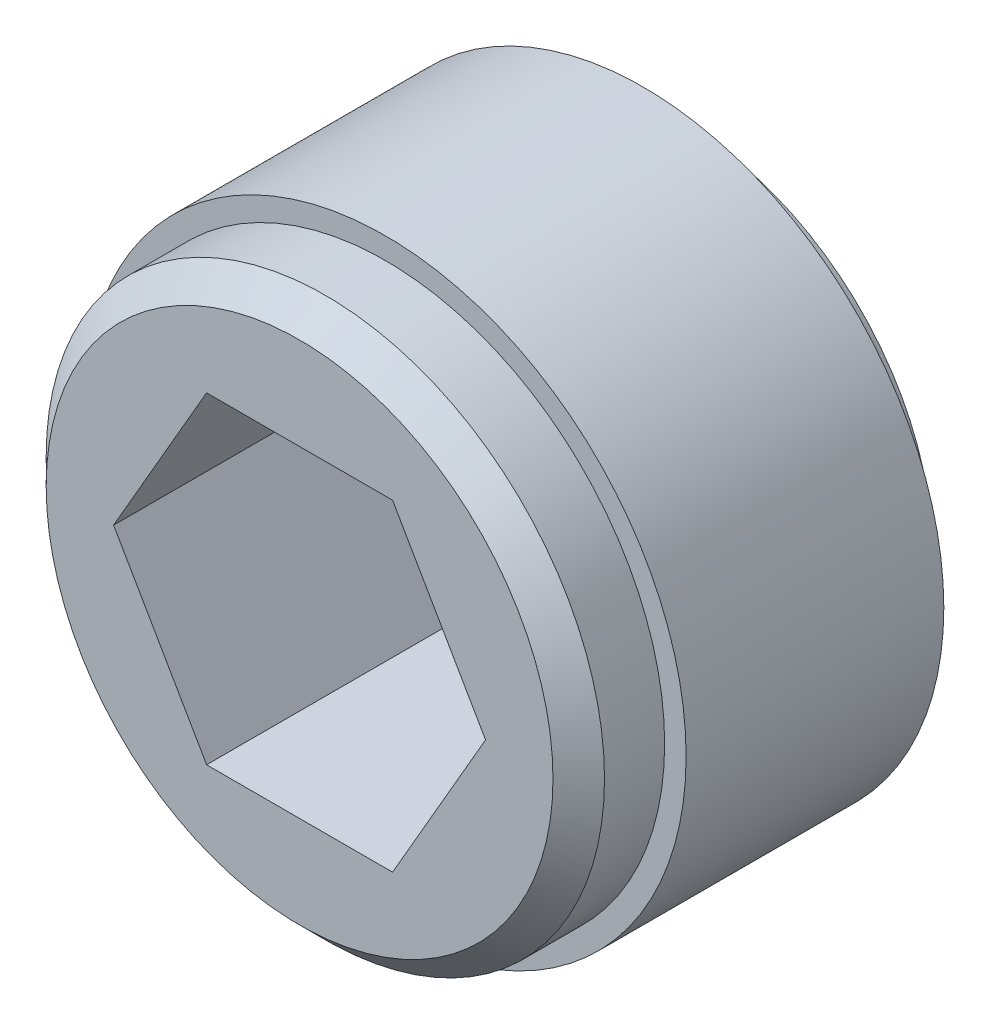
ISO-10303-21;
HEADER;
FILE_DESCRIPTION(('STEP AP214'),'2;1');
FILE_NAME('part.step','',(''),(''),'','','');
FILE_SCHEMA(('AUTOMOTIVE_DESIGN { 1 0 10303 214 1 1 1 1 }'));
ENDSEC;
DATA;
#1=APPLICATION_CONTEXT('core data for automotive mechanical design processes');
#2=APPLICATION_PROTOCOL_DEFINITION('international standard','automotive_design',2000,#1);
#3=PRODUCT_CONTEXT('',#1,'mechanical');
#4=PRODUCT('Part','Part','',(#3));
#5=PRODUCT_RELATED_PRODUCT_CATEGORY('part','',(#4));
#6=PRODUCT_DEFINITION_FORMATION('','',#4);
#7=PRODUCT_DEFINITION_CONTEXT('part definition',#1,'design');
#8=PRODUCT_DEFINITION('design','',#6,#7);
#9=PRODUCT_DEFINITION_SHAPE('','',#8);
#10=(LENGTH_UNIT() NAMED_UNIT(*) SI_UNIT(.MILLI.,.METRE.));
#11=(NAMED_UNIT(*) PLANE_ANGLE_UNIT() SI_UNIT($,.RADIAN.));
#12=(NAMED_UNIT(*) SI_UNIT($,.STERADIAN.) SOLID_ANGLE_UNIT());
#13=UNCERTAINTY_MEASURE_WITH_UNIT(LENGTH_MEASURE(1.E-05),#10,'distance_accuracy_value','');
#14=(GEOMETRIC_REPRESENTATION_CONTEXT(3) GLOBAL_UNCERTAINTY_ASSIGNED_CONTEXT((#13)) GLOBAL_UNIT_ASSIGNED_CONTEXT((#10,
#11,#12)) REPRESENTATION_CONTEXT('',''));
#15=CARTESIAN_POINT('',(0.,0.,0.));
#16=DIRECTION('',(0.,0.,1.));
#17=DIRECTION('',(1.,0.,0.));
#18=AXIS2_PLACEMENT_3D('',#15,#16,#17);
#19=CARTESIAN_POINT('',(0.,0.,5.08));
#20=DIRECTION('',(0.,0.,-1.));
#21=DIRECTION('',(-1.,0.,0.));
#22=AXIS2_PLACEMENT_3D('',#19,#20,#21);
#23=CYLINDRICAL_SURFACE('',#22,4.445);
#24=CARTESIAN_POINT('',(0.,0.,0.));
#25=DIRECTION('',(0.,0.,1.));
#26=DIRECTION('',(1.,0.,0.));
#27=AXIS2_PLACEMENT_3D('',#24,#25,#26);
#28=CIRCLE('',#27,4.445);
#29=CARTESIAN_POINT('',(4.445,0.,0.));
#30=VERTEX_POINT('',#29);
#31=EDGE_CURVE('E158',#30,#30,#28,.T.);
#32=ORIENTED_EDGE('',*,*,#31,.T.);
#33=EDGE_LOOP('',(#32));
#34=FACE_BOUND('',#33,.T.);
#35=CARTESIAN_POINT('',(0.,0.,3.81));
#36=DIRECTION('',(0.,0.,1.));
#37=DIRECTION('',(1.,0.,0.));
#38=AXIS2_PLACEMENT_3D('',#35,#36,#37);
#39=CIRCLE('',#38,4.445);
#40=CARTESIAN_POINT('',(4.445,0.,3.81));
#41=VERTEX_POINT('',#40);
#42=EDGE_CURVE('E151',#41,#41,#39,.T.);
#43=ORIENTED_EDGE('',*,*,#42,.F.);
#44=EDGE_LOOP('',(#43));
#45=FACE_BOUND('',#44,.T.);
#46=ADVANCED_FACE('F42',(#34,#45),#23,.T.);
#47=CARTESIAN_POINT('',(0.,0.,0.));
#48=DIRECTION('',(0.,0.,1.));
#49=DIRECTION('',(1.,0.,0.));
#50=AXIS2_PLACEMENT_3D('',#47,#48,#49);
#51=PLANE('',#50);
#52=CARTESIAN_POINT('',(0.,0.,0.));
#53=DIRECTION('',(0.,0.,-1.));
#54=DIRECTION('',(-1.,0.,0.));
#55=AXIS2_PLACEMENT_3D('',#52,#53,#54);
#56=CIRCLE('',#55,3.81);
#57=CARTESIAN_POINT('',(-3.81,0.,0.));
#58=VERTEX_POINT('',#57);
#59=EDGE_CURVE('E155',#58,#58,#56,.T.);
#60=ORIENTED_EDGE('',*,*,#59,.F.);
#61=EDGE_LOOP('',(#60));
#62=FACE_BOUND('',#61,.T.);
#63=ORIENTED_EDGE('',*,*,#31,.F.);
#64=EDGE_LOOP('',(#63));
#65=FACE_BOUND('',#64,.T.);
#66=ADVANCED_FACE('F180',(#62,#65),#51,.F.);
#67=CARTESIAN_POINT('',(0.,0.,0.));
#68=DIRECTION('',(0.,0.,1.));
#69=DIRECTION('',(-1.,0.,0.));
#70=AXIS2_PLACEMENT_3D('',#67,#68,#69);
#71=CONICAL_SURFACE('',#70,3.81,0.26179938779915);
#72=CARTESIAN_POINT('',(0.,0.,-0.635));
#73=DIRECTION('',(0.,0.,-1.));
#74=DIRECTION('',(-1.,0.,0.));
#75=AXIS2_PLACEMENT_3D('',#72,#73,#74);
#76=CIRCLE('',#75,3.63985226280624);
#77=CARTESIAN_POINT('',(-3.63985226280624,0.,-0.635));
#78=VERTEX_POINT('',#77);
#79=EDGE_CURVE('E154',#78,#78,#76,.T.);
#80=ORIENTED_EDGE('',*,*,#79,.F.);
#81=EDGE_LOOP('',(#80));
#82=FACE_BOUND('',#81,.T.);
#83=ORIENTED_EDGE('',*,*,#59,.T.);
#84=EDGE_LOOP('',(#83));
#85=FACE_BOUND('',#84,.T.);
#86=ADVANCED_FACE('F185',(#82,#85),#71,.T.);
#87=CARTESIAN_POINT('',(0.,0.,-0.635));
#88=DIRECTION('',(0.,0.,-1.));
#89=DIRECTION('',(-1.,0.,0.));
#90=AXIS2_PLACEMENT_3D('',#87,#88,#89);
#91=PLANE('',#90);
#92=DIRECTION('',(-1.,0.,0.));
#93=VECTOR('',#92,1.);
#94=CARTESIAN_POINT('',(1.3748153285078,2.38125,-0.635));
#95=LINE('',#94,#93);
#96=CARTESIAN_POINT('',(1.3748153285078,2.38125,-0.635));
#97=VERTEX_POINT('',#96);
#98=CARTESIAN_POINT('',(-1.3748153285078,2.38125,-0.635));
#99=VERTEX_POINT('',#98);
#100=EDGE_CURVE('E98',#97,#99,#95,.T.);
#101=ORIENTED_EDGE('',*,*,#100,.T.);
#102=DIRECTION('',(-0.5,-0.866025403784439,0.));
#103=VECTOR('',#102,1.);
#104=CARTESIAN_POINT('',(-1.3748153285078,2.38125,-0.635));
#105=LINE('',#104,#103);
#106=CARTESIAN_POINT('',(-2.74963065701559,0.,-0.635));
#107=VERTEX_POINT('',#106);
#108=EDGE_CURVE('E107',#99,#107,#105,.T.);
#109=ORIENTED_EDGE('',*,*,#108,.T.);
#110=DIRECTION('',(0.5,-0.866025403784439,0.));
#111=VECTOR('',#110,1.);
#112=CARTESIAN_POINT('',(-2.74963065701559,0.,-0.635));
#113=LINE('',#112,#111);
#114=CARTESIAN_POINT('',(-1.3748153285078,-2.38125,-0.635));
#115=VERTEX_POINT('',#114);
#116=EDGE_CURVE('E58',#107,#115,#113,.T.);
#117=ORIENTED_EDGE('',*,*,#116,.T.);
#118=DIRECTION('',(1.,0.,0.));
#119=VECTOR('',#118,1.);
#120=CARTESIAN_POINT('',(-1.3748153285078,-2.38125,-0.635));
#121=LINE('',#120,#119);
#122=CARTESIAN_POINT('',(1.3748153285078,-2.38125,-0.635));
#123=VERTEX_POINT('',#122);
#124=EDGE_CURVE('E122',#115,#123,#121,.T.);
#125=ORIENTED_EDGE('',*,*,#124,.T.);
#126=DIRECTION('',(0.5,0.866025403784439,0.));
#127=VECTOR('',#126,1.);
#128=CARTESIAN_POINT('',(1.3748153285078,-2.38125,-0.635));
#129=LINE('',#128,#127);
#130=CARTESIAN_POINT('',(2.74963065701559,0.,-0.635));
#131=VERTEX_POINT('',#130);
#132=EDGE_CURVE('E125',#123,#131,#129,.T.);
#133=ORIENTED_EDGE('',*,*,#132,.T.);
#134=DIRECTION('',(-0.5,0.866025403784439,0.));
#135=VECTOR('',#134,1.);
#136=CARTESIAN_POINT('',(2.74963065701559,0.,-0.635));
#137=LINE('',#136,#135);
#138=EDGE_CURVE('E104',#131,#97,#137,.T.);
#139=ORIENTED_EDGE('',*,*,#138,.T.);
#140=EDGE_LOOP('',(#101,#109,#117,#125,#133,#139));
#141=FACE_BOUND('',#140,.T.);
#142=ORIENTED_EDGE('',*,*,#79,.T.);
#143=EDGE_LOOP('',(#142));
#144=FACE_BOUND('',#143,.T.);
#145=ADVANCED_FACE('F111',(#141,#144),#91,.T.);
#146=CARTESIAN_POINT('',(0.,0.,3.81));
#147=DIRECTION('',(0.,0.,1.));
#148=DIRECTION('',(1.,0.,0.));
#149=AXIS2_PLACEMENT_3D('',#146,#147,#148);
#150=CYLINDRICAL_SURFACE('',#149,4.1275);
#151=CARTESIAN_POINT('',(0.,0.,4.699));
#152=DIRECTION('',(0.,0.,1.));
#153=DIRECTION('',(1.,0.,0.));
#154=AXIS2_PLACEMENT_3D('',#151,#152,#153);
#155=CIRCLE('',#154,4.1275);
#156=CARTESIAN_POINT('',(4.1275,0.,4.699));
#157=VERTEX_POINT('',#156);
#158=EDGE_CURVE('E11',#157,#157,#155,.F.);
#159=ORIENTED_EDGE('',*,*,#158,.T.);
#160=EDGE_LOOP('',(#159));
#161=FACE_BOUND('',#160,.T.);
#162=CARTESIAN_POINT('',(0.,0.,3.81));
#163=DIRECTION('',(0.,0.,1.));
#164=DIRECTION('',(1.,0.,0.));
#165=AXIS2_PLACEMENT_3D('',#162,#163,#164);
#166=CIRCLE('',#165,4.1275);
#167=CARTESIAN_POINT('',(4.1275,0.,3.81));
#168=VERTEX_POINT('',#167);
#169=EDGE_CURVE('E141',#168,#168,#166,.T.);
#170=ORIENTED_EDGE('',*,*,#169,.T.);
#171=EDGE_LOOP('',(#170));
#172=FACE_BOUND('',#171,.T.);
#173=ADVANCED_FACE('F195',(#161,#172),#150,.T.);
#174=CARTESIAN_POINT('',(0.,0.,3.81));
#175=DIRECTION('',(0.,0.,1.));
#176=DIRECTION('',(1.,0.,0.));
#177=AXIS2_PLACEMENT_3D('',#174,#175,#176);
#178=PLANE('',#177);
#179=ORIENTED_EDGE('',*,*,#169,.F.);
#180=EDGE_LOOP('',(#179));
#181=FACE_BOUND('',#180,.T.);
#182=ORIENTED_EDGE('',*,*,#42,.T.);
#183=EDGE_LOOP('',(#182));
#184=FACE_BOUND('',#183,.T.);
#185=ADVANCED_FACE('F175',(#181,#184),#178,.T.);
#186=CARTESIAN_POINT('',(0.,0.,5.08));
#187=DIRECTION('',(0.,0.,1.));
#188=DIRECTION('',(1.,0.,0.));
#189=AXIS2_PLACEMENT_3D('',#186,#187,#188);
#190=PLANE('',#189);
#191=DIRECTION('',(-1.,0.,0.));
#192=VECTOR('',#191,1.);
#193=CARTESIAN_POINT('',(1.3748153285078,2.38125,5.08));
#194=LINE('',#193,#192);
#195=CARTESIAN_POINT('',(1.3748153285078,2.38125,5.08));
#196=VERTEX_POINT('',#195);
#197=CARTESIAN_POINT('',(-1.3748153285078,2.38125,5.08));
#198=VERTEX_POINT('',#197);
#199=EDGE_CURVE('E66',#196,#198,#194,.T.);
#200=ORIENTED_EDGE('',*,*,#199,.F.);
#201=DIRECTION('',(-0.5,0.866025403784439,0.));
#202=VECTOR('',#201,1.);
#203=CARTESIAN_POINT('',(2.74963065701559,0.,5.08));
#204=LINE('',#203,#202);
#205=CARTESIAN_POINT('',(2.74963065701559,0.,5.08));
#206=VERTEX_POINT('',#205);
#207=EDGE_CURVE('E115',#206,#196,#204,.T.);
#208=ORIENTED_EDGE('',*,*,#207,.F.);
#209=DIRECTION('',(0.5,0.866025403784439,0.));
#210=VECTOR('',#209,1.);
#211=CARTESIAN_POINT('',(1.3748153285078,-2.38125,5.08));
#212=LINE('',#211,#210);
#213=CARTESIAN_POINT('',(1.3748153285078,-2.38125,5.08));
#214=VERTEX_POINT('',#213);
#215=EDGE_CURVE('E118',#214,#206,#212,.T.);
#216=ORIENTED_EDGE('',*,*,#215,.F.);
#217=DIRECTION('',(1.,0.,0.));
#218=VECTOR('',#217,1.);
#219=CARTESIAN_POINT('',(-1.3748153285078,-2.38125,5.08));
#220=LINE('',#219,#218);
#221=CARTESIAN_POINT('',(-1.3748153285078,-2.38125,5.08));
#222=VERTEX_POINT('',#221);
#223=EDGE_CURVE('E134',#222,#214,#220,.T.);
#224=ORIENTED_EDGE('',*,*,#223,.F.);
#225=DIRECTION('',(0.5,-0.866025403784439,0.));
#226=VECTOR('',#225,1.);
#227=CARTESIAN_POINT('',(-2.74963065701559,0.,5.08));
#228=LINE('',#227,#226);
#229=CARTESIAN_POINT('',(-2.74963065701559,0.,5.08));
#230=VERTEX_POINT('',#229);
#231=EDGE_CURVE('E131',#230,#222,#228,.T.);
#232=ORIENTED_EDGE('',*,*,#231,.F.);
#233=DIRECTION('',(-0.5,-0.866025403784439,0.));
#234=VECTOR('',#233,1.);
#235=CARTESIAN_POINT('',(-1.3748153285078,2.38125,5.08));
#236=LINE('',#235,#234);
#237=EDGE_CURVE('E129',#198,#230,#236,.T.);
#238=ORIENTED_EDGE('',*,*,#237,.F.);
#239=EDGE_LOOP('',(#200,#208,#216,#224,#232,#238));
#240=FACE_BOUND('',#239,.T.);
#241=CARTESIAN_POINT('',(0.,0.,5.08));
#242=DIRECTION('',(0.,0.,1.));
#243=DIRECTION('',(1.,0.,0.));
#244=AXIS2_PLACEMENT_3D('',#241,#242,#243);
#245=CIRCLE('',#244,3.7465);
#246=CARTESIAN_POINT('',(3.7465,0.,5.08));
#247=VERTEX_POINT('',#246);
#248=EDGE_CURVE('E51',#247,#247,#245,.T.);
#249=ORIENTED_EDGE('',*,*,#248,.T.);
#250=EDGE_LOOP('',(#249));
#251=FACE_BOUND('',#250,.T.);
#252=ADVANCED_FACE('F165',(#240,#251),#190,.T.);
#253=CARTESIAN_POINT('',(0.,0.,5.08));
#254=DIRECTION('',(0.,0.,-1.));
#255=DIRECTION('',(-1.,0.,0.));
#256=AXIS2_PLACEMENT_3D('',#253,#254,#255);
#257=CONICAL_SURFACE('',#256,3.7465,0.785398163397448);
#258=ORIENTED_EDGE('',*,*,#158,.F.);
#259=EDGE_LOOP('',(#258));
#260=FACE_BOUND('',#259,.T.);
#261=ORIENTED_EDGE('',*,*,#248,.F.);
#262=EDGE_LOOP('',(#261));
#263=FACE_BOUND('',#262,.T.);
#264=ADVANCED_FACE('F45',(#260,#263),#257,.T.);
#265=CARTESIAN_POINT('',(1.3748153285078,2.38125,-0.635));
#266=DIRECTION('',(0.,1.,0.));
#267=DIRECTION('',(0.,0.,1.));
#268=AXIS2_PLACEMENT_3D('',#265,#266,#267);
#269=PLANE('',#268);
#270=ORIENTED_EDGE('',*,*,#199,.T.);
#271=DIRECTION('',(0.,0.,1.));
#272=VECTOR('',#271,1.);
#273=CARTESIAN_POINT('',(-1.3748153285078,2.38125,-0.635));
#274=LINE('',#273,#272);
#275=EDGE_CURVE('E94',#99,#198,#274,.T.);
#276=ORIENTED_EDGE('',*,*,#275,.F.);
#277=ORIENTED_EDGE('',*,*,#100,.F.);
#278=DIRECTION('',(0.,0.,1.));
#279=VECTOR('',#278,1.);
#280=CARTESIAN_POINT('',(1.3748153285078,2.38125,-0.635));
#281=LINE('',#280,#279);
#282=EDGE_CURVE('E139',#97,#196,#281,.T.);
#283=ORIENTED_EDGE('',*,*,#282,.T.);
#284=EDGE_LOOP('',(#270,#276,#277,#283));
#285=FACE_BOUND('',#284,.T.);
#286=ADVANCED_FACE('F96',(#285),#269,.F.);
#287=CARTESIAN_POINT('',(2.74963065701559,0.,-0.635));
#288=DIRECTION('',(0.866025403784438,0.5,0.));
#289=DIRECTION('',(-0.5,0.866025403784439,0.));
#290=AXIS2_PLACEMENT_3D('',#287,#288,#289);
#291=PLANE('',#290);
#292=ORIENTED_EDGE('',*,*,#207,.T.);
#293=ORIENTED_EDGE('',*,*,#282,.F.);
#294=ORIENTED_EDGE('',*,*,#138,.F.);
#295=DIRECTION('',(0.,0.,1.));
#296=VECTOR('',#295,1.);
#297=CARTESIAN_POINT('',(2.74963065701559,0.,-0.635));
#298=LINE('',#297,#296);
#299=EDGE_CURVE('E142',#131,#206,#298,.T.);
#300=ORIENTED_EDGE('',*,*,#299,.T.);
#301=EDGE_LOOP('',(#292,#293,#294,#300));
#302=FACE_BOUND('',#301,.T.);
#303=ADVANCED_FACE('F173',(#302),#291,.F.);
#304=CARTESIAN_POINT('',(1.3748153285078,-2.38125,-0.635));
#305=DIRECTION('',(0.866025403784439,-0.5,0.));
#306=DIRECTION('',(0.5,0.866025403784439,0.));
#307=AXIS2_PLACEMENT_3D('',#304,#305,#306);
#308=PLANE('',#307);
#309=ORIENTED_EDGE('',*,*,#215,.T.);
#310=ORIENTED_EDGE('',*,*,#299,.F.);
#311=ORIENTED_EDGE('',*,*,#132,.F.);
#312=DIRECTION('',(0.,0.,1.));
#313=VECTOR('',#312,1.);
#314=CARTESIAN_POINT('',(1.3748153285078,-2.38125,-0.635));
#315=LINE('',#314,#313);
#316=EDGE_CURVE('E144',#123,#214,#315,.T.);
#317=ORIENTED_EDGE('',*,*,#316,.T.);
#318=EDGE_LOOP('',(#309,#310,#311,#317));
#319=FACE_BOUND('',#318,.T.);
#320=ADVANCED_FACE('F210',(#319),#308,.F.);
#321=CARTESIAN_POINT('',(-1.3748153285078,-2.38125,-0.635));
#322=DIRECTION('',(0.,-1.,0.));
#323=DIRECTION('',(1.,0.,0.));
#324=AXIS2_PLACEMENT_3D('',#321,#322,#323);
#325=PLANE('',#324);
#326=ORIENTED_EDGE('',*,*,#223,.T.);
#327=ORIENTED_EDGE('',*,*,#316,.F.);
#328=ORIENTED_EDGE('',*,*,#124,.F.);
#329=DIRECTION('',(0.,0.,1.));
#330=VECTOR('',#329,1.);
#331=CARTESIAN_POINT('',(-1.3748153285078,-2.38125,-0.635));
#332=LINE('',#331,#330);
#333=EDGE_CURVE('E146',#115,#222,#332,.T.);
#334=ORIENTED_EDGE('',*,*,#333,.T.);
#335=EDGE_LOOP('',(#326,#327,#328,#334));
#336=FACE_BOUND('',#335,.T.);
#337=ADVANCED_FACE('F207',(#336),#325,.F.);
#338=CARTESIAN_POINT('',(-2.74963065701559,0.,-0.635));
#339=DIRECTION('',(-0.866025403784438,-0.5,0.));
#340=DIRECTION('',(0.5,-0.866025403784439,0.));
#341=AXIS2_PLACEMENT_3D('',#338,#339,#340);
#342=PLANE('',#341);
#343=ORIENTED_EDGE('',*,*,#231,.T.);
#344=ORIENTED_EDGE('',*,*,#333,.F.);
#345=ORIENTED_EDGE('',*,*,#116,.F.);
#346=DIRECTION('',(0.,0.,1.));
#347=VECTOR('',#346,1.);
#348=CARTESIAN_POINT('',(-2.74963065701559,0.,-0.635));
#349=LINE('',#348,#347);
#350=EDGE_CURVE('E103',#107,#230,#349,.T.);
#351=ORIENTED_EDGE('',*,*,#350,.T.);
#352=EDGE_LOOP('',(#343,#344,#345,#351));
#353=FACE_BOUND('',#352,.T.);
#354=ADVANCED_FACE('F204',(#353),#342,.F.);
#355=CARTESIAN_POINT('',(-1.3748153285078,2.38125,-0.635));
#356=DIRECTION('',(-0.866025403784439,0.5,0.));
#357=DIRECTION('',(-0.5,-0.866025403784439,0.));
#358=AXIS2_PLACEMENT_3D('',#355,#356,#357);
#359=PLANE('',#358);
#360=ORIENTED_EDGE('',*,*,#237,.T.);
#361=ORIENTED_EDGE('',*,*,#350,.F.);
#362=ORIENTED_EDGE('',*,*,#108,.F.);
#363=ORIENTED_EDGE('',*,*,#275,.T.);
#364=EDGE_LOOP('',(#360,#361,#362,#363));
#365=FACE_BOUND('',#364,.T.);
#366=ADVANCED_FACE('F108',(#365),#359,.F.);
#367=CLOSED_SHELL('',(#46,#66,#86,#145,#173,#185,#252,#264,#286,#303,#320,#337,#354,#366));
#368=MANIFOLD_SOLID_BREP('B2',#367);
#369=ADVANCED_BREP_SHAPE_REPRESENTATION('',(#18,#368),#14);
#370=SHAPE_DEFINITION_REPRESENTATION(#9,#369);
ENDSEC;
END-ISO-10303-21;
